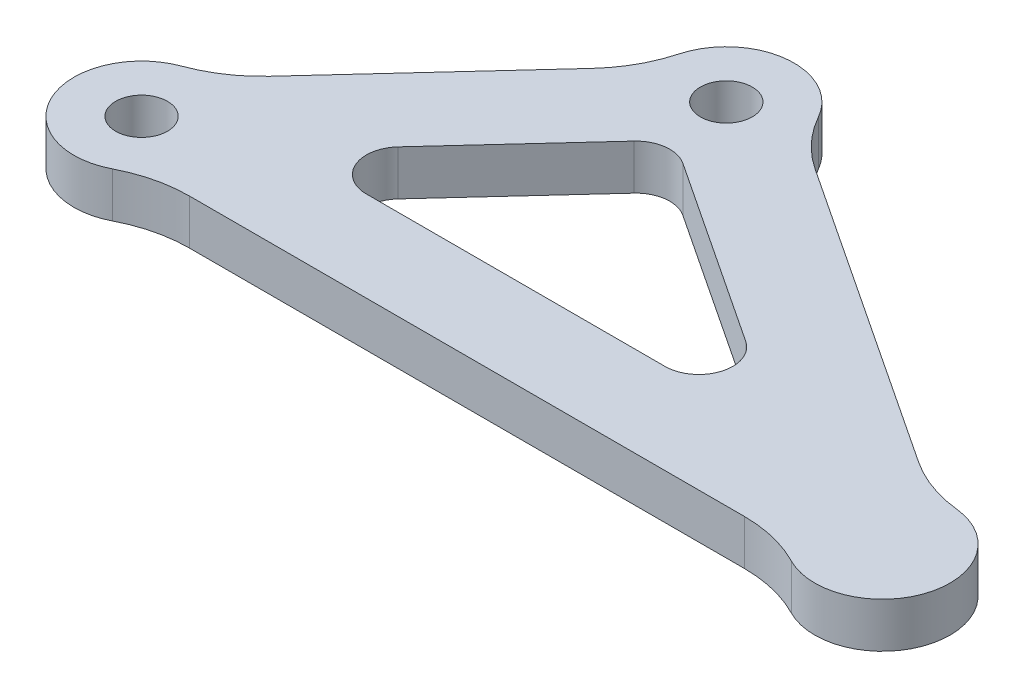
ISO-10303-21;
HEADER;
FILE_DESCRIPTION(('STEP AP214'),'2;1');
FILE_NAME('part.step','',(''),(''),'','','');
FILE_SCHEMA(('AUTOMOTIVE_DESIGN { 1 0 10303 214 1 1 1 1 }'));
ENDSEC;
DATA;
#1=APPLICATION_CONTEXT('core data for automotive mechanical design processes');
#2=APPLICATION_PROTOCOL_DEFINITION('international standard','automotive_design',2000,#1);
#3=PRODUCT_CONTEXT('',#1,'mechanical');
#4=PRODUCT('Part','Part','',(#3));
#5=PRODUCT_RELATED_PRODUCT_CATEGORY('part','',(#4));
#6=PRODUCT_DEFINITION_FORMATION('','',#4);
#7=PRODUCT_DEFINITION_CONTEXT('part definition',#1,'design');
#8=PRODUCT_DEFINITION('design','',#6,#7);
#9=PRODUCT_DEFINITION_SHAPE('','',#8);
#10=(LENGTH_UNIT() NAMED_UNIT(*) SI_UNIT(.MILLI.,.METRE.));
#11=(NAMED_UNIT(*) PLANE_ANGLE_UNIT() SI_UNIT($,.RADIAN.));
#12=(NAMED_UNIT(*) SI_UNIT($,.STERADIAN.) SOLID_ANGLE_UNIT());
#13=UNCERTAINTY_MEASURE_WITH_UNIT(LENGTH_MEASURE(1.E-05),#10,'distance_accuracy_value','');
#14=(GEOMETRIC_REPRESENTATION_CONTEXT(3) GLOBAL_UNCERTAINTY_ASSIGNED_CONTEXT((#13)) GLOBAL_UNIT_ASSIGNED_CONTEXT((#10,
#11,#12)) REPRESENTATION_CONTEXT('',''));
#15=CARTESIAN_POINT('',(0.,0.,0.));
#16=DIRECTION('',(0.,0.,1.));
#17=DIRECTION('',(1.,0.,0.));
#18=AXIS2_PLACEMENT_3D('',#15,#16,#17);
#19=CARTESIAN_POINT('',(0.,2.,2.));
#20=DIRECTION('',(0.,0.,-1.));
#21=DIRECTION('',(-1.,0.,0.));
#22=AXIS2_PLACEMENT_3D('',#19,#20,#21);
#23=PLANE('',#22);
#24=DIRECTION('',(1.,0.,0.));
#25=VECTOR('',#24,1.);
#26=CARTESIAN_POINT('',(0.,0.,2.));
#27=LINE('',#26,#25);
#28=CARTESIAN_POINT('',(4.12310562561766,0.,2.));
#29=VERTEX_POINT('',#28);
#30=CARTESIAN_POINT('',(28.7268943743823,0.,2.));
#31=VERTEX_POINT('',#30);
#32=EDGE_CURVE('E331',#29,#31,#27,.T.);
#33=ORIENTED_EDGE('',*,*,#32,.T.);
#34=DIRECTION('',(0.,1.,0.));
#35=VECTOR('',#34,1.);
#36=CARTESIAN_POINT('',(28.7268943743823,2.,2.));
#37=LINE('',#36,#35);
#38=CARTESIAN_POINT('',(28.7268943743823,2.,2.));
#39=VERTEX_POINT('',#38);
#40=EDGE_CURVE('E221',#31,#39,#37,.T.);
#41=ORIENTED_EDGE('',*,*,#40,.T.);
#42=DIRECTION('',(1.,0.,0.));
#43=VECTOR('',#42,1.);
#44=CARTESIAN_POINT('',(0.,2.,2.));
#45=LINE('',#44,#43);
#46=CARTESIAN_POINT('',(4.12310562561766,2.,2.));
#47=VERTEX_POINT('',#46);
#48=EDGE_CURVE('E308',#47,#39,#45,.T.);
#49=ORIENTED_EDGE('',*,*,#48,.F.);
#50=DIRECTION('',(0.,1.,0.));
#51=VECTOR('',#50,1.);
#52=CARTESIAN_POINT('',(4.12310562561766,0.,2.));
#53=LINE('',#52,#51);
#54=EDGE_CURVE('E218',#47,#29,#53,.F.);
#55=ORIENTED_EDGE('',*,*,#54,.T.);
#56=EDGE_LOOP('',(#33,#41,#49,#55));
#57=FACE_BOUND('',#56,.T.);
#58=ADVANCED_FACE('F41',(#57),#23,.F.);
#59=CARTESIAN_POINT('',(32.85,2.,0.));
#60=DIRECTION('',(0.,-1.,0.));
#61=DIRECTION('',(0.,0.,-1.));
#62=AXIS2_PLACEMENT_3D('',#59,#60,#61);
#63=CYLINDRICAL_SURFACE('',#62,3.);
#64=CARTESIAN_POINT('',(32.85,0.,0.));
#65=DIRECTION('',(0.,1.,0.));
#66=DIRECTION('',(0.,0.,1.));
#67=AXIS2_PLACEMENT_3D('',#64,#65,#66);
#68=CIRCLE('',#67,3.);
#69=CARTESIAN_POINT('',(31.4756314581274,0.,2.66666666666667));
#70=VERTEX_POINT('',#69);
#71=CARTESIAN_POINT('',(33.1744703939884,0.,-2.98240154295579));
#72=VERTEX_POINT('',#71);
#73=EDGE_CURVE('E201',#70,#72,#68,.T.);
#74=ORIENTED_EDGE('',*,*,#73,.T.);
#75=DIRECTION('',(0.,-1.,0.));
#76=VECTOR('',#75,1.);
#77=CARTESIAN_POINT('',(33.1744703939884,2.,-2.98240154295579));
#78=LINE('',#77,#76);
#79=CARTESIAN_POINT('',(33.1744703939884,2.,-2.98240154295579));
#80=VERTEX_POINT('',#79);
#81=EDGE_CURVE('E216',#72,#80,#78,.F.);
#82=ORIENTED_EDGE('',*,*,#81,.T.);
#83=CARTESIAN_POINT('',(32.85,2.,0.));
#84=DIRECTION('',(0.,1.,0.));
#85=DIRECTION('',(0.,0.,1.));
#86=AXIS2_PLACEMENT_3D('',#83,#84,#85);
#87=CIRCLE('',#86,3.);
#88=CARTESIAN_POINT('',(31.4756314581274,2.,2.66666666666667));
#89=VERTEX_POINT('',#88);
#90=EDGE_CURVE('E311',#89,#80,#87,.T.);
#91=ORIENTED_EDGE('',*,*,#90,.F.);
#92=DIRECTION('',(0.,-1.,0.));
#93=VECTOR('',#92,1.);
#94=CARTESIAN_POINT('',(31.4756314581274,2.,2.66666666666667));
#95=LINE('',#94,#93);
#96=EDGE_CURVE('E213',#89,#70,#95,.T.);
#97=ORIENTED_EDGE('',*,*,#96,.T.);
#98=EDGE_LOOP('',(#74,#82,#91,#97));
#99=FACE_BOUND('',#98,.T.);
#100=ADVANCED_FACE('F337',(#99),#63,.T.);
#101=CARTESIAN_POINT('',(11.0972616520989,2.,-16.7819633468892));
#102=DIRECTION('',(0.55157480487106,0.,-0.834125430994315));
#103=DIRECTION('',(-0.834125430994315,0.,-0.55157480487106));
#104=AXIS2_PLACEMENT_3D('',#101,#102,#103);
#105=PLANE('',#104);
#106=DIRECTION('',(0.834125430994315,0.,0.55157480487106));
#107=VECTOR('',#106,1.);
#108=CARTESIAN_POINT('',(11.0972616520989,0.,-16.7819633468892));
#109=LINE('',#108,#107);
#110=CARTESIAN_POINT('',(16.9562638073848,0.,-12.9076324004168));
#111=VERTEX_POINT('',#110);
#112=CARTESIAN_POINT('',(30.5139623527387,0.,-3.94245204290146));
#113=VERTEX_POINT('',#112);
#114=EDGE_CURVE('E196',#111,#113,#109,.T.);
#115=ORIENTED_EDGE('',*,*,#114,.F.);
#116=DIRECTION('',(0.,-1.,0.));
#117=VECTOR('',#116,1.);
#118=CARTESIAN_POINT('',(16.9562638073848,2.,-12.9076324004168));
#119=LINE('',#118,#117);
#120=CARTESIAN_POINT('',(16.9562638073848,2.,-12.9076324004168));
#121=VERTEX_POINT('',#120);
#122=EDGE_CURVE('E172',#111,#121,#119,.F.);
#123=ORIENTED_EDGE('',*,*,#122,.T.);
#124=DIRECTION('',(0.834125430994315,0.,0.55157480487106));
#125=VECTOR('',#124,1.);
#126=CARTESIAN_POINT('',(11.0972616520989,2.,-16.7819633468892));
#127=LINE('',#126,#125);
#128=CARTESIAN_POINT('',(30.5139623527387,2.,-3.94245204290146));
#129=VERTEX_POINT('',#128);
#130=EDGE_CURVE('E314',#121,#129,#127,.T.);
#131=ORIENTED_EDGE('',*,*,#130,.T.);
#132=DIRECTION('',(0.,-1.,0.));
#133=VECTOR('',#132,1.);
#134=CARTESIAN_POINT('',(30.5139623527387,2.,-3.94245204290146));
#135=LINE('',#134,#133);
#136=EDGE_CURVE('E188',#129,#113,#135,.T.);
#137=ORIENTED_EDGE('',*,*,#136,.T.);
#138=EDGE_LOOP('',(#115,#123,#131,#137));
#139=FACE_BOUND('',#138,.T.);
#140=ADVANCED_FACE('F347',(#139),#105,.T.);
#141=CARTESIAN_POINT('',(12.4139269406393,2.,-13.513582719341));
#142=DIRECTION('',(0.,-1.,0.));
#143=DIRECTION('',(0.,0.,-1.));
#144=AXIS2_PLACEMENT_3D('',#141,#142,#143);
#145=CYLINDRICAL_SURFACE('',#144,3.);
#146=CARTESIAN_POINT('',(12.4139269406393,2.,-13.513582719341));
#147=DIRECTION('',(0.,1.,0.));
#148=DIRECTION('',(0.,0.,1.));
#149=AXIS2_PLACEMENT_3D('',#146,#147,#148);
#150=CIRCLE('',#149,3.);
#151=CARTESIAN_POINT('',(15.0311888392966,2.,-14.9798501416882));
#152=VERTEX_POINT('',#151);
#153=CARTESIAN_POINT('',(9.52032850722085,2.,-14.3054716674381));
#154=VERTEX_POINT('',#153);
#155=EDGE_CURVE('E187',#152,#154,#150,.T.);
#156=ORIENTED_EDGE('',*,*,#155,.F.);
#157=DIRECTION('',(0.,-1.,0.));
#158=VECTOR('',#157,1.);
#159=CARTESIAN_POINT('',(15.0311888392966,2.,-14.9798501416882));
#160=LINE('',#159,#158);
#161=CARTESIAN_POINT('',(15.0311888392966,0.,-14.9798501416882));
#162=VERTEX_POINT('',#161);
#163=EDGE_CURVE('E171',#152,#162,#160,.T.);
#164=ORIENTED_EDGE('',*,*,#163,.T.);
#165=CARTESIAN_POINT('',(12.4139269406393,0.,-13.513582719341));
#166=DIRECTION('',(0.,1.,0.));
#167=DIRECTION('',(0.,0.,1.));
#168=AXIS2_PLACEMENT_3D('',#165,#166,#167);
#169=CIRCLE('',#168,3.);
#170=CARTESIAN_POINT('',(9.52032850722085,0.,-14.3054716674381));
#171=VERTEX_POINT('',#170);
#172=EDGE_CURVE('E184',#162,#171,#169,.T.);
#173=ORIENTED_EDGE('',*,*,#172,.T.);
#174=DIRECTION('',(0.,-1.,0.));
#175=VECTOR('',#174,1.);
#176=CARTESIAN_POINT('',(9.52032850722085,2.,-14.3054716674381));
#177=LINE('',#176,#175);
#178=EDGE_CURVE('E189',#171,#154,#177,.F.);
#179=ORIENTED_EDGE('',*,*,#178,.T.);
#180=EDGE_LOOP('',(#156,#164,#173,#179));
#181=FACE_BOUND('',#180,.T.);
#182=ADVANCED_FACE('F183',(#181),#145,.T.);
#183=CARTESIAN_POINT('',(-1.47287005115433,2.,-1.35301656028766));
#184=DIRECTION('',(0.736435025577164,0.,0.676508280143829));
#185=DIRECTION('',(0.676508280143829,0.,-0.736435025577164));
#186=AXIS2_PLACEMENT_3D('',#183,#184,#185);
#187=PLANE('',#186);
#188=DIRECTION('',(-0.676508280143829,0.,0.736435025577164));
#189=VECTOR('',#188,1.);
#190=CARTESIAN_POINT('',(-1.47287005115433,2.,-1.35301656028766));
#191=LINE('',#190,#189);
#192=CARTESIAN_POINT('',(8.151741793847,2.,-11.8301998827695));
#193=VERTEX_POINT('',#192);
#194=CARTESIAN_POINT('',(1.31644504448363,2.,-4.38941595714675));
#195=VERTEX_POINT('',#194);
#196=EDGE_CURVE('E318',#193,#195,#191,.T.);
#197=ORIENTED_EDGE('',*,*,#196,.F.);
#198=DIRECTION('',(0.,1.,0.));
#199=VECTOR('',#198,1.);
#200=CARTESIAN_POINT('',(8.151741793847,0.,-11.8301998827695));
#201=LINE('',#200,#199);
#202=CARTESIAN_POINT('',(8.151741793847,0.,-11.8301998827695));
#203=VERTEX_POINT('',#202);
#204=EDGE_CURVE('E178',#193,#203,#201,.F.);
#205=ORIENTED_EDGE('',*,*,#204,.T.);
#206=DIRECTION('',(-0.676508280143829,0.,0.736435025577164));
#207=VECTOR('',#206,1.);
#208=CARTESIAN_POINT('',(-1.47287005115433,0.,-1.35301656028766));
#209=LINE('',#208,#207);
#210=CARTESIAN_POINT('',(1.31644504448363,0.,-4.38941595714675));
#211=VERTEX_POINT('',#210);
#212=EDGE_CURVE('E195',#203,#211,#209,.T.);
#213=ORIENTED_EDGE('',*,*,#212,.T.);
#214=DIRECTION('',(0.,1.,0.));
#215=VECTOR('',#214,1.);
#216=CARTESIAN_POINT('',(1.31644504448363,2.,-4.38941595714675));
#217=LINE('',#216,#215);
#218=EDGE_CURVE('E228',#211,#195,#217,.T.);
#219=ORIENTED_EDGE('',*,*,#218,.T.);
#220=EDGE_LOOP('',(#197,#205,#213,#219));
#221=FACE_BOUND('',#220,.T.);
#222=ADVANCED_FACE('F354',(#221),#187,.F.);
#223=CARTESIAN_POINT('',(0.,2.,-2.));
#224=DIRECTION('',(0.,0.,-1.));
#225=DIRECTION('',(-1.,0.,0.));
#226=AXIS2_PLACEMENT_3D('',#223,#224,#225);
#227=PLANE('',#226);
#228=DIRECTION('',(1.,0.,0.));
#229=VECTOR('',#228,1.);
#230=CARTESIAN_POINT('',(0.,0.,-2.));
#231=LINE('',#230,#229);
#232=CARTESIAN_POINT('',(7.96781627259604,0.,-2.));
#233=VERTEX_POINT('',#232);
#234=CARTESIAN_POINT('',(21.2116166804777,0.,-2.));
#235=VERTEX_POINT('',#234);
#236=EDGE_CURVE('E279',#233,#235,#231,.T.);
#237=ORIENTED_EDGE('',*,*,#236,.F.);
#238=DIRECTION('',(0.,-1.,0.));
#239=VECTOR('',#238,1.);
#240=CARTESIAN_POINT('',(7.96781627259604,2.,-2.));
#241=LINE('',#240,#239);
#242=CARTESIAN_POINT('',(7.96781627259604,2.,-2.));
#243=VERTEX_POINT('',#242);
#244=EDGE_CURVE('E260',#233,#243,#241,.F.);
#245=ORIENTED_EDGE('',*,*,#244,.T.);
#246=DIRECTION('',(1.,0.,0.));
#247=VECTOR('',#246,1.);
#248=CARTESIAN_POINT('',(0.,2.,-2.));
#249=LINE('',#248,#247);
#250=CARTESIAN_POINT('',(21.2116166804777,2.,-2.));
#251=VERTEX_POINT('',#250);
#252=EDGE_CURVE('E207',#243,#251,#249,.T.);
#253=ORIENTED_EDGE('',*,*,#252,.T.);
#254=DIRECTION('',(0.,-1.,0.));
#255=VECTOR('',#254,1.);
#256=CARTESIAN_POINT('',(21.2116166804777,2.,-2.));
#257=LINE('',#256,#255);
#258=EDGE_CURVE('E257',#251,#235,#257,.T.);
#259=ORIENTED_EDGE('',*,*,#258,.T.);
#260=EDGE_LOOP('',(#237,#245,#253,#259));
#261=FACE_BOUND('',#260,.T.);
#262=ADVANCED_FACE('F295',(#261),#227,.T.);
#263=CARTESIAN_POINT('',(1.47287005115433,2.,1.35301656028766));
#264=DIRECTION('',(-0.736435025577164,0.,-0.67650828014383));
#265=DIRECTION('',(-0.67650828014383,0.,0.736435025577164));
#266=AXIS2_PLACEMENT_3D('',#263,#264,#265);
#267=PLANE('',#266);
#268=DIRECTION('',(0.67650828014383,0.,-0.736435025577164));
#269=VECTOR('',#268,1.);
#270=CARTESIAN_POINT('',(1.47287005115433,2.,1.35301656028766));
#271=LINE('',#270,#269);
#272=CARTESIAN_POINT('',(6.86316373423029,2.,-4.51476242021575));
#273=VERTEX_POINT('',#272);
#274=CARTESIAN_POINT('',(11.8679604063719,2.,-9.96289612890221));
#275=VERTEX_POINT('',#274);
#276=EDGE_CURVE('E297',#273,#275,#271,.T.);
#277=ORIENTED_EDGE('',*,*,#276,.F.);
#278=DIRECTION('',(0.,-1.,0.));
#279=VECTOR('',#278,1.);
#280=CARTESIAN_POINT('',(6.86316373423029,2.,-4.51476242021574));
#281=LINE('',#280,#279);
#282=CARTESIAN_POINT('',(6.86316373423029,0.,-4.51476242021575));
#283=VERTEX_POINT('',#282);
#284=EDGE_CURVE('E254',#273,#283,#281,.T.);
#285=ORIENTED_EDGE('',*,*,#284,.T.);
#286=DIRECTION('',(0.67650828014383,0.,-0.736435025577164));
#287=VECTOR('',#286,1.);
#288=CARTESIAN_POINT('',(1.47287005115433,0.,1.35301656028766));
#289=LINE('',#288,#287);
#290=CARTESIAN_POINT('',(11.8679604063719,0.,-9.96289612890221));
#291=VERTEX_POINT('',#290);
#292=EDGE_CURVE('E285',#283,#291,#289,.T.);
#293=ORIENTED_EDGE('',*,*,#292,.T.);
#294=DIRECTION('',(0.,-1.,0.));
#295=VECTOR('',#294,1.);
#296=CARTESIAN_POINT('',(11.8679604063719,2.,-9.96289612890221));
#297=LINE('',#296,#295);
#298=EDGE_CURVE('E252',#291,#275,#297,.F.);
#299=ORIENTED_EDGE('',*,*,#298,.T.);
#300=EDGE_LOOP('',(#277,#285,#293,#299));
#301=FACE_BOUND('',#300,.T.);
#302=ADVANCED_FACE('F368',(#301),#267,.F.);
#303=CARTESIAN_POINT('',(12.4139269406393,2.,-13.513582719341));
#304=DIRECTION('',(0.,-1.,0.));
#305=DIRECTION('',(0.,0.,-1.));
#306=AXIS2_PLACEMENT_3D('',#303,#304,#305);
#307=CYLINDRICAL_SURFACE('',#306,1.15);
#308=CARTESIAN_POINT('',(12.4139269406393,2.,-13.513582719341));
#309=DIRECTION('',(0.,1.,0.));
#310=DIRECTION('',(0.,0.,1.));
#311=AXIS2_PLACEMENT_3D('',#308,#309,#310);
#312=CIRCLE('',#311,1.15);
#313=CARTESIAN_POINT('',(12.4139269406393,2.,-12.363582719341));
#314=VERTEX_POINT('',#313);
#315=EDGE_CURVE('E305',#314,#314,#312,.T.);
#316=ORIENTED_EDGE('',*,*,#315,.T.);
#317=EDGE_LOOP('',(#316));
#318=FACE_BOUND('',#317,.T.);
#319=CARTESIAN_POINT('',(12.4139269406393,0.,-13.513582719341));
#320=DIRECTION('',(0.,1.,0.));
#321=DIRECTION('',(0.,0.,1.));
#322=AXIS2_PLACEMENT_3D('',#319,#320,#321);
#323=CIRCLE('',#322,1.15);
#324=CARTESIAN_POINT('',(12.4139269406393,0.,-12.363582719341));
#325=VERTEX_POINT('',#324);
#326=EDGE_CURVE('E328',#325,#325,#323,.T.);
#327=ORIENTED_EDGE('',*,*,#326,.F.);
#328=EDGE_LOOP('',(#327));
#329=FACE_BOUND('',#328,.T.);
#330=ADVANCED_FACE('F364',(#318,#329),#307,.F.);
#331=CARTESIAN_POINT('',(0.,2.,0.));
#332=DIRECTION('',(0.,-1.,0.));
#333=DIRECTION('',(0.,0.,-1.));
#334=AXIS2_PLACEMENT_3D('',#331,#332,#333);
#335=CYLINDRICAL_SURFACE('',#334,1.15);
#336=CARTESIAN_POINT('',(0.,2.,0.));
#337=DIRECTION('',(0.,1.,0.));
#338=DIRECTION('',(0.,0.,1.));
#339=AXIS2_PLACEMENT_3D('',#336,#337,#338);
#340=CIRCLE('',#339,1.15);
#341=CARTESIAN_POINT('',(0.,2.,1.15));
#342=VERTEX_POINT('',#341);
#343=EDGE_CURVE('E302',#342,#342,#340,.T.);
#344=ORIENTED_EDGE('',*,*,#343,.T.);
#345=EDGE_LOOP('',(#344));
#346=FACE_BOUND('',#345,.T.);
#347=CARTESIAN_POINT('',(0.,0.,0.));
#348=DIRECTION('',(0.,1.,0.));
#349=DIRECTION('',(0.,0.,1.));
#350=AXIS2_PLACEMENT_3D('',#347,#348,#349);
#351=CIRCLE('',#350,1.15);
#352=CARTESIAN_POINT('',(0.,0.,1.15));
#353=VERTEX_POINT('',#352);
#354=EDGE_CURVE('E284',#353,#353,#351,.T.);
#355=ORIENTED_EDGE('',*,*,#354,.F.);
#356=EDGE_LOOP('',(#355));
#357=FACE_BOUND('',#356,.T.);
#358=ADVANCED_FACE('F367',(#346,#357),#335,.F.);
#359=CARTESIAN_POINT('',(8.89096243261466,2.,-13.4454616229119));
#360=DIRECTION('',(0.55157480487106,0.,-0.834125430994315));
#361=DIRECTION('',(-0.834125430994315,0.,-0.55157480487106));
#362=AXIS2_PLACEMENT_3D('',#359,#360,#361);
#363=PLANE('',#362);
#364=DIRECTION('',(0.834125430994315,0.,0.55157480487106));
#365=VECTOR('',#364,1.);
#366=CARTESIAN_POINT('',(8.89096243261466,2.,-13.4454616229119));
#367=LINE('',#366,#365);
#368=CARTESIAN_POINT('',(13.7999751520442,2.,-10.1993218551779));
#369=VERTEX_POINT('',#368);
#370=CARTESIAN_POINT('',(22.0389788877843,2.,-4.75118814649147));
#371=VERTEX_POINT('',#370);
#372=EDGE_CURVE('E293',#369,#371,#367,.T.);
#373=ORIENTED_EDGE('',*,*,#372,.F.);
#374=DIRECTION('',(0.,-1.,0.));
#375=VECTOR('',#374,1.);
#376=CARTESIAN_POINT('',(13.7999751520442,0.,-10.1993218551779));
#377=LINE('',#376,#375);
#378=CARTESIAN_POINT('',(13.7999751520442,0.,-10.1993218551779));
#379=VERTEX_POINT('',#378);
#380=EDGE_CURVE('E263',#369,#379,#377,.T.);
#381=ORIENTED_EDGE('',*,*,#380,.T.);
#382=DIRECTION('',(0.834125430994315,0.,0.55157480487106));
#383=VECTOR('',#382,1.);
#384=CARTESIAN_POINT('',(8.89096243261466,0.,-13.4454616229119));
#385=LINE('',#384,#383);
#386=CARTESIAN_POINT('',(22.0389788877843,0.,-4.75118814649147));
#387=VERTEX_POINT('',#386);
#388=EDGE_CURVE('E277',#379,#387,#385,.T.);
#389=ORIENTED_EDGE('',*,*,#388,.T.);
#390=DIRECTION('',(0.,-1.,0.));
#391=VECTOR('',#390,1.);
#392=CARTESIAN_POINT('',(22.0389788877843,2.,-4.75118814649147));
#393=LINE('',#392,#391);
#394=EDGE_CURVE('E56',#387,#371,#393,.F.);
#395=ORIENTED_EDGE('',*,*,#394,.T.);
#396=EDGE_LOOP('',(#373,#381,#389,#395));
#397=FACE_BOUND('',#396,.T.);
#398=ADVANCED_FACE('F282',(#397),#363,.F.);
#399=CARTESIAN_POINT('',(0.,2.,0.));
#400=DIRECTION('',(0.,-1.,0.));
#401=DIRECTION('',(0.,0.,-1.));
#402=AXIS2_PLACEMENT_3D('',#399,#400,#401);
#403=CYLINDRICAL_SURFACE('',#402,3.);
#404=CARTESIAN_POINT('',(0.,0.,0.));
#405=DIRECTION('',(0.,1.,0.));
#406=DIRECTION('',(0.,0.,1.));
#407=AXIS2_PLACEMENT_3D('',#404,#405,#406);
#408=CIRCLE('',#407,3.);
#409=CARTESIAN_POINT('',(-1.03405503632645,0.,-2.81615521266991));
#410=VERTEX_POINT('',#409);
#411=CARTESIAN_POINT('',(1.37436854187255,0.,2.66666666666667));
#412=VERTEX_POINT('',#411);
#413=EDGE_CURVE('E199',#410,#412,#408,.T.);
#414=ORIENTED_EDGE('',*,*,#413,.T.);
#415=DIRECTION('',(0.,-1.,0.));
#416=VECTOR('',#415,1.);
#417=CARTESIAN_POINT('',(1.37436854187255,2.,2.66666666666667));
#418=LINE('',#417,#416);
#419=CARTESIAN_POINT('',(1.37436854187255,2.,2.66666666666667));
#420=VERTEX_POINT('',#419);
#421=EDGE_CURVE('E226',#412,#420,#418,.F.);
#422=ORIENTED_EDGE('',*,*,#421,.T.);
#423=CARTESIAN_POINT('',(0.,2.,0.));
#424=DIRECTION('',(0.,1.,0.));
#425=DIRECTION('',(0.,0.,1.));
#426=AXIS2_PLACEMENT_3D('',#423,#424,#425);
#427=CIRCLE('',#426,3.);
#428=CARTESIAN_POINT('',(-1.03405503632645,2.,-2.81615521266991));
#429=VERTEX_POINT('',#428);
#430=EDGE_CURVE('E208',#429,#420,#427,.T.);
#431=ORIENTED_EDGE('',*,*,#430,.F.);
#432=DIRECTION('',(0.,-1.,0.));
#433=VECTOR('',#432,1.);
#434=CARTESIAN_POINT('',(-1.03405503632645,2.,-2.81615521266991));
#435=LINE('',#434,#433);
#436=EDGE_CURVE('E223',#429,#410,#435,.T.);
#437=ORIENTED_EDGE('',*,*,#436,.T.);
#438=EDGE_LOOP('',(#414,#422,#431,#437));
#439=FACE_BOUND('',#438,.T.);
#440=ADVANCED_FACE('F374',(#439),#403,.T.);
#441=CARTESIAN_POINT('',(0.,2.,0.));
#442=DIRECTION('',(0.,1.,0.));
#443=DIRECTION('',(0.,0.,1.));
#444=AXIS2_PLACEMENT_3D('',#441,#442,#443);
#445=PLANE('',#444);
#446=ORIENTED_EDGE('',*,*,#252,.F.);
#447=CARTESIAN_POINT('',(7.96781627259604,2.,-3.5));
#448=DIRECTION('',(0.,1.,0.));
#449=DIRECTION('',(0.,0.,1.));
#450=AXIS2_PLACEMENT_3D('',#447,#448,#449);
#451=CIRCLE('',#450,1.5);
#452=EDGE_CURVE('E268',#243,#273,#451,.F.);
#453=ORIENTED_EDGE('',*,*,#452,.T.);
#454=ORIENTED_EDGE('',*,*,#276,.T.);
#455=CARTESIAN_POINT('',(12.9726129447376,2.,-8.94813370868647));
#456=DIRECTION('',(0.,1.,0.));
#457=DIRECTION('',(0.,0.,1.));
#458=AXIS2_PLACEMENT_3D('',#455,#456,#457);
#459=CIRCLE('',#458,1.5);
#460=EDGE_CURVE('E63',#275,#369,#459,.F.);
#461=ORIENTED_EDGE('',*,*,#460,.T.);
#462=ORIENTED_EDGE('',*,*,#372,.T.);
#463=CARTESIAN_POINT('',(21.2116166804777,2.,-3.5));
#464=DIRECTION('',(0.,1.,0.));
#465=DIRECTION('',(0.,0.,1.));
#466=AXIS2_PLACEMENT_3D('',#463,#464,#465);
#467=CIRCLE('',#466,1.5);
#468=EDGE_CURVE('E11',#371,#251,#467,.F.);
#469=ORIENTED_EDGE('',*,*,#468,.T.);
#470=EDGE_LOOP('',(#446,#453,#454,#461,#462,#469));
#471=FACE_BOUND('',#470,.T.);
#472=ORIENTED_EDGE('',*,*,#343,.F.);
#473=EDGE_LOOP('',(#472));
#474=FACE_BOUND('',#473,.T.);
#475=ORIENTED_EDGE('',*,*,#315,.F.);
#476=EDGE_LOOP('',(#475));
#477=FACE_BOUND('',#476,.T.);
#478=ORIENTED_EDGE('',*,*,#430,.T.);
#479=CARTESIAN_POINT('',(4.12310562561766,2.,8.));
#480=DIRECTION('',(0.,1.,0.));
#481=DIRECTION('',(0.,0.,1.));
#482=AXIS2_PLACEMENT_3D('',#479,#480,#481);
#483=CIRCLE('',#482,6.);
#484=EDGE_CURVE('E243',#420,#47,#483,.F.);
#485=ORIENTED_EDGE('',*,*,#484,.T.);
#486=ORIENTED_EDGE('',*,*,#48,.T.);
#487=CARTESIAN_POINT('',(28.7268943743823,2.,8.));
#488=DIRECTION('',(0.,1.,0.));
#489=DIRECTION('',(0.,0.,1.));
#490=AXIS2_PLACEMENT_3D('',#487,#488,#489);
#491=CIRCLE('',#490,6.);
#492=EDGE_CURVE('E239',#39,#89,#491,.F.);
#493=ORIENTED_EDGE('',*,*,#492,.T.);
#494=ORIENTED_EDGE('',*,*,#90,.T.);
#495=CARTESIAN_POINT('',(33.823411181965,2.,-8.94720462886735));
#496=DIRECTION('',(0.,1.,0.));
#497=DIRECTION('',(0.,0.,1.));
#498=AXIS2_PLACEMENT_3D('',#495,#496,#497);
#499=CIRCLE('',#498,6.);
#500=EDGE_CURVE('E235',#80,#129,#499,.F.);
#501=ORIENTED_EDGE('',*,*,#500,.T.);
#502=ORIENTED_EDGE('',*,*,#130,.F.);
#503=CARTESIAN_POINT('',(20.2657126366112,2.,-17.9123849863826));
#504=DIRECTION('',(0.,1.,0.));
#505=DIRECTION('',(0.,0.,1.));
#506=AXIS2_PLACEMENT_3D('',#503,#504,#505);
#507=CIRCLE('',#506,6.);
#508=EDGE_CURVE('E177',#121,#152,#507,.F.);
#509=ORIENTED_EDGE('',*,*,#508,.T.);
#510=ORIENTED_EDGE('',*,*,#155,.T.);
#511=CARTESIAN_POINT('',(3.73313164038402,2.,-15.8892495636325));
#512=DIRECTION('',(0.,1.,0.));
#513=DIRECTION('',(0.,0.,1.));
#514=AXIS2_PLACEMENT_3D('',#511,#512,#513);
#515=CIRCLE('',#514,6.);
#516=EDGE_CURVE('E246',#154,#193,#515,.F.);
#517=ORIENTED_EDGE('',*,*,#516,.T.);
#518=ORIENTED_EDGE('',*,*,#196,.T.);
#519=CARTESIAN_POINT('',(-3.10216510897936,2.,-8.44846563800973));
#520=DIRECTION('',(0.,1.,0.));
#521=DIRECTION('',(0.,0.,1.));
#522=AXIS2_PLACEMENT_3D('',#519,#520,#521);
#523=CIRCLE('',#522,6.);
#524=EDGE_CURVE('E250',#195,#429,#523,.F.);
#525=ORIENTED_EDGE('',*,*,#524,.T.);
#526=EDGE_LOOP('',(#478,#485,#486,#493,#494,#501,#502,#509,#510,#517,#518,#525));
#527=FACE_BOUND('',#526,.T.);
#528=ADVANCED_FACE('F290',(#471,#474,#477,#527),#445,.T.);
#529=CARTESIAN_POINT('',(0.,0.,0.));
#530=DIRECTION('',(0.,1.,0.));
#531=DIRECTION('',(0.,0.,1.));
#532=AXIS2_PLACEMENT_3D('',#529,#530,#531);
#533=PLANE('',#532);
#534=ORIENTED_EDGE('',*,*,#292,.F.);
#535=CARTESIAN_POINT('',(7.96781627259604,0.,-3.5));
#536=DIRECTION('',(0.,1.,0.));
#537=DIRECTION('',(0.,0.,1.));
#538=AXIS2_PLACEMENT_3D('',#535,#536,#537);
#539=CIRCLE('',#538,1.5);
#540=EDGE_CURVE('E266',#283,#233,#539,.T.);
#541=ORIENTED_EDGE('',*,*,#540,.T.);
#542=ORIENTED_EDGE('',*,*,#236,.T.);
#543=CARTESIAN_POINT('',(21.2116166804777,0.,-3.5));
#544=DIRECTION('',(0.,1.,0.));
#545=DIRECTION('',(0.,0.,1.));
#546=AXIS2_PLACEMENT_3D('',#543,#544,#545);
#547=CIRCLE('',#546,1.5);
#548=EDGE_CURVE('E49',#235,#387,#547,.T.);
#549=ORIENTED_EDGE('',*,*,#548,.T.);
#550=ORIENTED_EDGE('',*,*,#388,.F.);
#551=CARTESIAN_POINT('',(12.9726129447376,0.,-8.94813370868647));
#552=DIRECTION('',(0.,1.,0.));
#553=DIRECTION('',(0.,0.,1.));
#554=AXIS2_PLACEMENT_3D('',#551,#552,#553);
#555=CIRCLE('',#554,1.5);
#556=EDGE_CURVE('E270',#379,#291,#555,.T.);
#557=ORIENTED_EDGE('',*,*,#556,.T.);
#558=EDGE_LOOP('',(#534,#541,#542,#549,#550,#557));
#559=FACE_BOUND('',#558,.T.);
#560=ORIENTED_EDGE('',*,*,#354,.T.);
#561=EDGE_LOOP('',(#560));
#562=FACE_BOUND('',#561,.T.);
#563=ORIENTED_EDGE('',*,*,#326,.T.);
#564=EDGE_LOOP('',(#563));
#565=FACE_BOUND('',#564,.T.);
#566=ORIENTED_EDGE('',*,*,#32,.F.);
#567=CARTESIAN_POINT('',(4.12310562561766,0.,8.));
#568=DIRECTION('',(0.,1.,0.));
#569=DIRECTION('',(0.,0.,1.));
#570=AXIS2_PLACEMENT_3D('',#567,#568,#569);
#571=CIRCLE('',#570,6.);
#572=EDGE_CURVE('E241',#29,#412,#571,.T.);
#573=ORIENTED_EDGE('',*,*,#572,.T.);
#574=ORIENTED_EDGE('',*,*,#413,.F.);
#575=CARTESIAN_POINT('',(-3.10216510897936,0.,-8.44846563800973));
#576=DIRECTION('',(0.,1.,0.));
#577=DIRECTION('',(0.,0.,1.));
#578=AXIS2_PLACEMENT_3D('',#575,#576,#577);
#579=CIRCLE('',#578,6.);
#580=EDGE_CURVE('E248',#410,#211,#579,.T.);
#581=ORIENTED_EDGE('',*,*,#580,.T.);
#582=ORIENTED_EDGE('',*,*,#212,.F.);
#583=CARTESIAN_POINT('',(3.73313164038402,0.,-15.8892495636325));
#584=DIRECTION('',(0.,1.,0.));
#585=DIRECTION('',(0.,0.,1.));
#586=AXIS2_PLACEMENT_3D('',#583,#584,#585);
#587=CIRCLE('',#586,6.);
#588=EDGE_CURVE('E194',#203,#171,#587,.T.);
#589=ORIENTED_EDGE('',*,*,#588,.T.);
#590=ORIENTED_EDGE('',*,*,#172,.F.);
#591=CARTESIAN_POINT('',(20.2657126366112,0.,-17.9123849863826));
#592=DIRECTION('',(0.,1.,0.));
#593=DIRECTION('',(0.,0.,1.));
#594=AXIS2_PLACEMENT_3D('',#591,#592,#593);
#595=CIRCLE('',#594,6.);
#596=EDGE_CURVE('E167',#162,#111,#595,.T.);
#597=ORIENTED_EDGE('',*,*,#596,.T.);
#598=ORIENTED_EDGE('',*,*,#114,.T.);
#599=CARTESIAN_POINT('',(33.823411181965,0.,-8.94720462886735));
#600=DIRECTION('',(0.,1.,0.));
#601=DIRECTION('',(0.,0.,1.));
#602=AXIS2_PLACEMENT_3D('',#599,#600,#601);
#603=CIRCLE('',#602,6.);
#604=EDGE_CURVE('E233',#113,#72,#603,.T.);
#605=ORIENTED_EDGE('',*,*,#604,.T.);
#606=ORIENTED_EDGE('',*,*,#73,.F.);
#607=CARTESIAN_POINT('',(28.7268943743823,0.,8.));
#608=DIRECTION('',(0.,1.,0.));
#609=DIRECTION('',(0.,0.,1.));
#610=AXIS2_PLACEMENT_3D('',#607,#608,#609);
#611=CIRCLE('',#610,6.);
#612=EDGE_CURVE('E237',#70,#31,#611,.T.);
#613=ORIENTED_EDGE('',*,*,#612,.T.);
#614=EDGE_LOOP('',(#566,#573,#574,#581,#582,#589,#590,#597,#598,#605,#606,#613));
#615=FACE_BOUND('',#614,.T.);
#616=ADVANCED_FACE('F192',(#559,#562,#565,#615),#533,.F.);
#617=CARTESIAN_POINT('',(20.2657126366112,2.,-17.9123849863826));
#618=DIRECTION('',(0.,-1.,0.));
#619=DIRECTION('',(0.,0.,-1.));
#620=AXIS2_PLACEMENT_3D('',#617,#618,#619);
#621=CYLINDRICAL_SURFACE('',#620,6.);
#622=ORIENTED_EDGE('',*,*,#508,.F.);
#623=ORIENTED_EDGE('',*,*,#122,.F.);
#624=ORIENTED_EDGE('',*,*,#596,.F.);
#625=ORIENTED_EDGE('',*,*,#163,.F.);
#626=EDGE_LOOP('',(#622,#623,#624,#625));
#627=FACE_BOUND('',#626,.T.);
#628=ADVANCED_FACE('F170',(#627),#621,.F.);
#629=CARTESIAN_POINT('',(33.823411181965,2.,-8.94720462886735));
#630=DIRECTION('',(0.,-1.,0.));
#631=DIRECTION('',(0.,0.,-1.));
#632=AXIS2_PLACEMENT_3D('',#629,#630,#631);
#633=CYLINDRICAL_SURFACE('',#632,6.);
#634=ORIENTED_EDGE('',*,*,#500,.F.);
#635=ORIENTED_EDGE('',*,*,#81,.F.);
#636=ORIENTED_EDGE('',*,*,#604,.F.);
#637=ORIENTED_EDGE('',*,*,#136,.F.);
#638=EDGE_LOOP('',(#634,#635,#636,#637));
#639=FACE_BOUND('',#638,.T.);
#640=ADVANCED_FACE('F342',(#639),#633,.F.);
#641=CARTESIAN_POINT('',(28.7268943743823,2.,8.));
#642=DIRECTION('',(0.,-1.,0.));
#643=DIRECTION('',(0.,0.,-1.));
#644=AXIS2_PLACEMENT_3D('',#641,#642,#643);
#645=CYLINDRICAL_SURFACE('',#644,6.);
#646=ORIENTED_EDGE('',*,*,#492,.F.);
#647=ORIENTED_EDGE('',*,*,#40,.F.);
#648=ORIENTED_EDGE('',*,*,#612,.F.);
#649=ORIENTED_EDGE('',*,*,#96,.F.);
#650=EDGE_LOOP('',(#646,#647,#648,#649));
#651=FACE_BOUND('',#650,.T.);
#652=ADVANCED_FACE('F384',(#651),#645,.F.);
#653=CARTESIAN_POINT('',(4.12310562561766,2.,8.));
#654=DIRECTION('',(0.,-1.,0.));
#655=DIRECTION('',(0.,0.,-1.));
#656=AXIS2_PLACEMENT_3D('',#653,#654,#655);
#657=CYLINDRICAL_SURFACE('',#656,6.);
#658=ORIENTED_EDGE('',*,*,#484,.F.);
#659=ORIENTED_EDGE('',*,*,#421,.F.);
#660=ORIENTED_EDGE('',*,*,#572,.F.);
#661=ORIENTED_EDGE('',*,*,#54,.F.);
#662=EDGE_LOOP('',(#658,#659,#660,#661));
#663=FACE_BOUND('',#662,.T.);
#664=ADVANCED_FACE('F387',(#663),#657,.F.);
#665=CARTESIAN_POINT('',(3.73313164038402,2.,-15.8892495636325));
#666=DIRECTION('',(0.,-1.,0.));
#667=DIRECTION('',(0.,0.,-1.));
#668=AXIS2_PLACEMENT_3D('',#665,#666,#667);
#669=CYLINDRICAL_SURFACE('',#668,6.);
#670=ORIENTED_EDGE('',*,*,#516,.F.);
#671=ORIENTED_EDGE('',*,*,#178,.F.);
#672=ORIENTED_EDGE('',*,*,#588,.F.);
#673=ORIENTED_EDGE('',*,*,#204,.F.);
#674=EDGE_LOOP('',(#670,#671,#672,#673));
#675=FACE_BOUND('',#674,.T.);
#676=ADVANCED_FACE('F391',(#675),#669,.F.);
#677=CARTESIAN_POINT('',(-3.10216510897936,2.,-8.44846563800973));
#678=DIRECTION('',(0.,-1.,0.));
#679=DIRECTION('',(0.,0.,-1.));
#680=AXIS2_PLACEMENT_3D('',#677,#678,#679);
#681=CYLINDRICAL_SURFACE('',#680,6.);
#682=ORIENTED_EDGE('',*,*,#524,.F.);
#683=ORIENTED_EDGE('',*,*,#218,.F.);
#684=ORIENTED_EDGE('',*,*,#580,.F.);
#685=ORIENTED_EDGE('',*,*,#436,.F.);
#686=EDGE_LOOP('',(#682,#683,#684,#685));
#687=FACE_BOUND('',#686,.T.);
#688=ADVANCED_FACE('F395',(#687),#681,.F.);
#689=CARTESIAN_POINT('',(7.96781627259604,2.,-3.5));
#690=DIRECTION('',(0.,-1.,0.));
#691=DIRECTION('',(0.,0.,-1.));
#692=AXIS2_PLACEMENT_3D('',#689,#690,#691);
#693=CYLINDRICAL_SURFACE('',#692,1.5);
#694=ORIENTED_EDGE('',*,*,#452,.F.);
#695=ORIENTED_EDGE('',*,*,#244,.F.);
#696=ORIENTED_EDGE('',*,*,#540,.F.);
#697=ORIENTED_EDGE('',*,*,#284,.F.);
#698=EDGE_LOOP('',(#694,#695,#696,#697));
#699=FACE_BOUND('',#698,.T.);
#700=ADVANCED_FACE('F399',(#699),#693,.F.);
#701=CARTESIAN_POINT('',(12.9726129447376,2.,-8.94813370868647));
#702=DIRECTION('',(0.,1.,0.));
#703=DIRECTION('',(0.,0.,1.));
#704=AXIS2_PLACEMENT_3D('',#701,#702,#703);
#705=CYLINDRICAL_SURFACE('',#704,1.5);
#706=ORIENTED_EDGE('',*,*,#460,.F.);
#707=ORIENTED_EDGE('',*,*,#298,.F.);
#708=ORIENTED_EDGE('',*,*,#556,.F.);
#709=ORIENTED_EDGE('',*,*,#380,.F.);
#710=EDGE_LOOP('',(#706,#707,#708,#709));
#711=FACE_BOUND('',#710,.T.);
#712=ADVANCED_FACE('F402',(#711),#705,.F.);
#713=CARTESIAN_POINT('',(21.2116166804777,2.,-3.5));
#714=DIRECTION('',(0.,-1.,0.));
#715=DIRECTION('',(0.,0.,-1.));
#716=AXIS2_PLACEMENT_3D('',#713,#714,#715);
#717=CYLINDRICAL_SURFACE('',#716,1.5);
#718=ORIENTED_EDGE('',*,*,#468,.F.);
#719=ORIENTED_EDGE('',*,*,#394,.F.);
#720=ORIENTED_EDGE('',*,*,#548,.F.);
#721=ORIENTED_EDGE('',*,*,#258,.F.);
#722=EDGE_LOOP('',(#718,#719,#720,#721));
#723=FACE_BOUND('',#722,.T.);
#724=ADVANCED_FACE('F43',(#723),#717,.F.);
#725=CLOSED_SHELL('',(#58,#100,#140,#182,#222,#262,#302,#330,#358,#398,#440,#528,#616,#628,#640,
#652,#664,#676,#688,#700,#712,#724));
#726=MANIFOLD_SOLID_BREP('B2',#725);
#727=ADVANCED_BREP_SHAPE_REPRESENTATION('',(#18,#726),#14);
#728=SHAPE_DEFINITION_REPRESENTATION(#9,#727);
ENDSEC;
END-ISO-10303-21;
